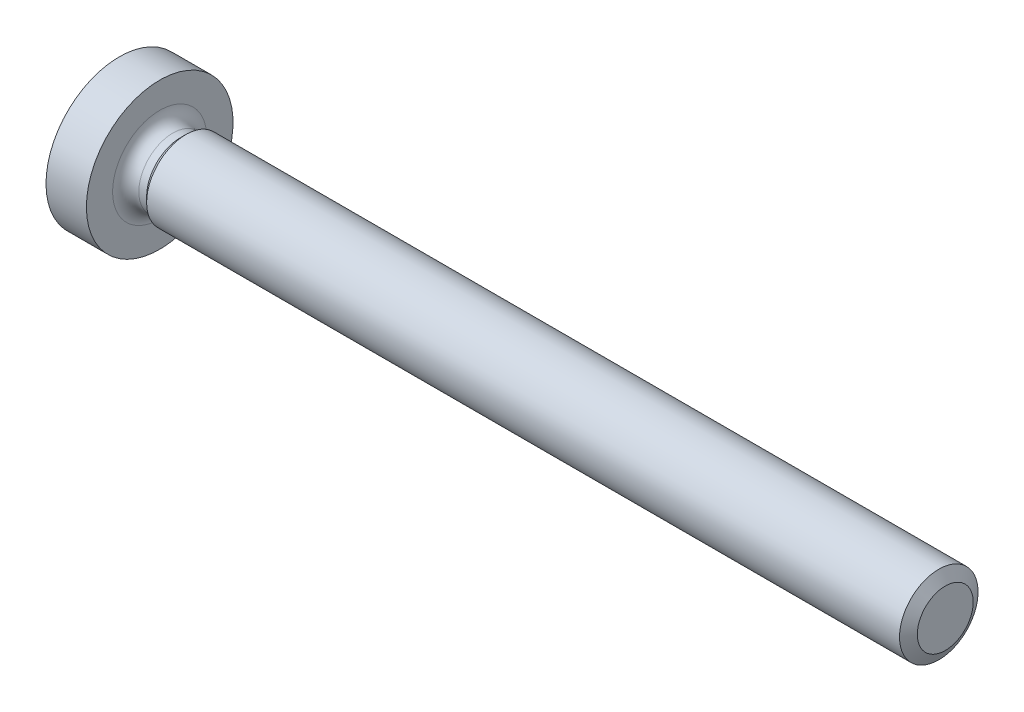
ISO-10303-21;
HEADER;
FILE_DESCRIPTION(('STEP AP214'),'2;1');
FILE_NAME('part.step','',(''),(''),'','','');
FILE_SCHEMA(('AUTOMOTIVE_DESIGN { 1 0 10303 214 1 1 1 1 }'));
ENDSEC;
DATA;
#1=APPLICATION_CONTEXT('core data for automotive mechanical design processes');
#2=APPLICATION_PROTOCOL_DEFINITION('international standard','automotive_design',2000,#1);
#3=PRODUCT_CONTEXT('',#1,'mechanical');
#4=PRODUCT('Part','Part','',(#3));
#5=PRODUCT_RELATED_PRODUCT_CATEGORY('part','',(#4));
#6=PRODUCT_DEFINITION_FORMATION('','',#4);
#7=PRODUCT_DEFINITION_CONTEXT('part definition',#1,'design');
#8=PRODUCT_DEFINITION('design','',#6,#7);
#9=PRODUCT_DEFINITION_SHAPE('','',#8);
#10=(LENGTH_UNIT() NAMED_UNIT(*) SI_UNIT(.MILLI.,.METRE.));
#11=(NAMED_UNIT(*) PLANE_ANGLE_UNIT() SI_UNIT($,.RADIAN.));
#12=(NAMED_UNIT(*) SI_UNIT($,.STERADIAN.) SOLID_ANGLE_UNIT());
#13=UNCERTAINTY_MEASURE_WITH_UNIT(LENGTH_MEASURE(1.E-05),#10,'distance_accuracy_value','');
#14=(GEOMETRIC_REPRESENTATION_CONTEXT(3) GLOBAL_UNCERTAINTY_ASSIGNED_CONTEXT((#13)) GLOBAL_UNIT_ASSIGNED_CONTEXT((#10,
#11,#12)) REPRESENTATION_CONTEXT('',''));
#15=CARTESIAN_POINT('',(0.,0.,0.));
#16=DIRECTION('',(0.,0.,1.));
#17=DIRECTION('',(1.,0.,0.));
#18=AXIS2_PLACEMENT_3D('',#15,#16,#17);
#19=CARTESIAN_POINT('',(1.8,0.,0.));
#20=DIRECTION('',(0.137568371274688,0.,-0.990492273177751));
#21=DIRECTION('',(-0.990492273177752,0.,-0.137568371274688));
#22=AXIS2_PLACEMENT_3D('',#19,#20,#21);
#23=PLANE('',#22);
#24=DIRECTION('',(-0.763885421064628,-0.636571184220523,-0.106095197370087));
#25=VECTOR('',#24,1.);
#26=CARTESIAN_POINT('',(1.8,0.,0.));
#27=LINE('',#26,#25);
#28=CARTESIAN_POINT('',(1.8,0.,0.));
#29=VERTEX_POINT('',#28);
#30=CARTESIAN_POINT('',(0.188839901093437,-1.34263341575547,-0.223772235959245));
#31=VERTEX_POINT('',#30);
#32=EDGE_CURVE('E168',#29,#31,#27,.T.);
#33=ORIENTED_EDGE('',*,*,#32,.F.);
#34=DIRECTION('',(-0.981250680241291,-0.136284816700179,-0.136284816700179));
#35=VECTOR('',#34,1.);
#36=CARTESIAN_POINT('',(1.8,0.,0.));
#37=LINE('',#36,#35);
#38=CARTESIAN_POINT('',(0.0123443765883179,-0.248285503251622,-0.248285503251623));
#39=VERTEX_POINT('',#38);
#40=EDGE_CURVE('E129',#29,#39,#37,.T.);
#41=ORIENTED_EDGE('',*,*,#40,.T.);
#42=CARTESIAN_POINT('',(4.93943981831946,0.,0.436033308099924));
#43=DIRECTION('',(0.137568371274688,0.,-0.990492273177751));
#44=DIRECTION('',(-0.990492273177752,0.,-0.137568371274688));
#45=AXIS2_PLACEMENT_3D('',#42,#43,#44);
#46=CIRCLE('',#45,4.98058304002877);
#47=EDGE_CURVE('E142',#31,#39,#46,.T.);
#48=ORIENTED_EDGE('',*,*,#47,.F.);
#49=EDGE_LOOP('',(#33,#41,#48));
#50=FACE_BOUND('',#49,.T.);
#51=ADVANCED_FACE('F49',(#50),#23,.F.);
#52=CARTESIAN_POINT('',(1.8,0.,0.));
#53=DIRECTION('',(0.137568371274688,0.,0.990492273177752));
#54=DIRECTION('',(0.990492273177752,0.,-0.137568371274688));
#55=AXIS2_PLACEMENT_3D('',#52,#53,#54);
#56=PLANE('',#55);
#57=CARTESIAN_POINT('',(4.93943981831946,0.,-0.436033308099924));
#58=DIRECTION('',(0.137568371274688,0.,0.990492273177752));
#59=DIRECTION('',(0.990492273177752,0.,-0.137568371274688));
#60=AXIS2_PLACEMENT_3D('',#57,#58,#59);
#61=CIRCLE('',#60,4.98058304002877);
#62=CARTESIAN_POINT('',(0.0123443765883179,-0.248285503251624,0.248285503251622));
#63=VERTEX_POINT('',#62);
#64=CARTESIAN_POINT('',(0.188839901093437,-1.34263341575547,0.223772235959245));
#65=VERTEX_POINT('',#64);
#66=EDGE_CURVE('E72',#63,#65,#61,.T.);
#67=ORIENTED_EDGE('',*,*,#66,.F.);
#68=DIRECTION('',(0.981250680241291,0.13628481670018,-0.136284816700179));
#69=VECTOR('',#68,1.);
#70=CARTESIAN_POINT('',(1.8,0.,0.));
#71=LINE('',#70,#69);
#72=EDGE_CURVE('E13',#63,#29,#71,.T.);
#73=ORIENTED_EDGE('',*,*,#72,.T.);
#74=DIRECTION('',(-0.763885421064628,-0.636571184220523,0.106095197370087));
#75=VECTOR('',#74,1.);
#76=CARTESIAN_POINT('',(1.8,0.,0.));
#77=LINE('',#76,#75);
#78=EDGE_CURVE('E169',#29,#65,#77,.T.);
#79=ORIENTED_EDGE('',*,*,#78,.T.);
#80=EDGE_LOOP('',(#67,#73,#79));
#81=FACE_BOUND('',#80,.T.);
#82=ADVANCED_FACE('F184',(#81),#56,.F.);
#83=CARTESIAN_POINT('',(-1.33175770411172,0.,0.));
#84=DIRECTION('',(-1.,0.,0.));
#85=DIRECTION('',(0.,0.,1.));
#86=AXIS2_PLACEMENT_3D('',#83,#84,#85);
#87=CYLINDRICAL_SURFACE('',#86,1.5);
#88=CARTESIAN_POINT('',(3.4,0.,0.));
#89=DIRECTION('',(-1.,0.,0.));
#90=DIRECTION('',(0.,0.,1.));
#91=AXIS2_PLACEMENT_3D('',#88,#89,#90);
#92=CIRCLE('',#91,1.5);
#93=CARTESIAN_POINT('',(3.4,0.,1.5));
#94=VERTEX_POINT('',#93);
#95=EDGE_CURVE('E205',#94,#94,#92,.T.);
#96=ORIENTED_EDGE('',*,*,#95,.F.);
#97=EDGE_LOOP('',(#96));
#98=FACE_BOUND('',#97,.T.);
#99=CARTESIAN_POINT('',(32.1527080028722,0.,0.));
#100=DIRECTION('',(-1.,0.,0.));
#101=DIRECTION('',(0.,0.,1.));
#102=AXIS2_PLACEMENT_3D('',#99,#100,#101);
#103=CIRCLE('',#102,1.5);
#104=CARTESIAN_POINT('',(32.1527080028722,0.,1.5));
#105=VERTEX_POINT('',#104);
#106=EDGE_CURVE('E202',#105,#105,#103,.T.);
#107=ORIENTED_EDGE('',*,*,#106,.T.);
#108=EDGE_LOOP('',(#107));
#109=FACE_BOUND('',#108,.T.);
#110=ADVANCED_FACE('F249',(#98,#109),#87,.T.);
#111=CARTESIAN_POINT('',(5.,0.,0.));
#112=DIRECTION('',(-1.,0.,0.));
#113=DIRECTION('',(0.,1.,0.));
#114=AXIS2_PLACEMENT_3D('',#111,#112,#113);
#115=SPHERICAL_SURFACE('',#114,5.);
#116=CARTESIAN_POINT('',(3.68852459016393,0.,-1.57377049180328));
#117=DIRECTION('',(0.64018439966448,0.,0.768221279597376));
#118=DIRECTION('',(0.768221279597376,0.,-0.64018439966448));
#119=AXIS2_PLACEMENT_3D('',#116,#117,#118);
#120=CIRCLE('',#119,4.56106113624062);
#121=CARTESIAN_POINT('',(0.188839901093437,0.22377223595924,1.34263341575547));
#122=VERTEX_POINT('',#121);
#123=CARTESIAN_POINT('',(0.188839901093437,-0.22377223595925,1.34263341575547));
#124=VERTEX_POINT('',#123);
#125=EDGE_CURVE('E135',#122,#124,#120,.T.);
#126=ORIENTED_EDGE('',*,*,#125,.T.);
#127=CARTESIAN_POINT('',(4.93943981831946,0.436033308099924,0.));
#128=DIRECTION('',(0.137568371274688,-0.990492273177751,0.));
#129=DIRECTION('',(0.990492273177752,0.137568371274688,0.));
#130=AXIS2_PLACEMENT_3D('',#127,#128,#129);
#131=CIRCLE('',#130,4.98058304002877);
#132=EDGE_CURVE('E151',#124,#63,#131,.T.);
#133=ORIENTED_EDGE('',*,*,#132,.T.);
#134=ORIENTED_EDGE('',*,*,#66,.T.);
#135=CARTESIAN_POINT('',(3.68852459016393,1.57377049180328,0.));
#136=DIRECTION('',(0.64018439966448,-0.768221279597376,0.));
#137=DIRECTION('',(0.768221279597376,0.64018439966448,0.));
#138=AXIS2_PLACEMENT_3D('',#135,#136,#137);
#139=CIRCLE('',#138,4.56106113624062);
#140=EDGE_CURVE('E181',#65,#31,#139,.T.);
#141=ORIENTED_EDGE('',*,*,#140,.T.);
#142=ORIENTED_EDGE('',*,*,#47,.T.);
#143=CARTESIAN_POINT('',(0.188839901093437,-0.22377223595924,-1.34263341575547));
#144=VERTEX_POINT('',#143);
#145=EDGE_CURVE('E131',#39,#144,#131,.T.);
#146=ORIENTED_EDGE('',*,*,#145,.T.);
#147=CARTESIAN_POINT('',(3.68852459016393,0.,1.57377049180328));
#148=DIRECTION('',(0.64018439966448,0.,-0.768221279597376));
#149=DIRECTION('',(-0.768221279597376,0.,-0.64018439966448));
#150=AXIS2_PLACEMENT_3D('',#147,#148,#149);
#151=CIRCLE('',#150,4.56106113624062);
#152=CARTESIAN_POINT('',(0.188839901093437,0.223772235959249,-1.34263341575547));
#153=VERTEX_POINT('',#152);
#154=EDGE_CURVE('E123',#144,#153,#151,.T.);
#155=ORIENTED_EDGE('',*,*,#154,.T.);
#156=CARTESIAN_POINT('',(4.93943981831946,-0.436033308099924,0.));
#157=DIRECTION('',(0.137568371274688,0.990492273177752,0.));
#158=DIRECTION('',(-0.990492273177752,0.137568371274688,0.));
#159=AXIS2_PLACEMENT_3D('',#156,#157,#158);
#160=CIRCLE('',#159,4.98058304002877);
#161=CARTESIAN_POINT('',(0.0123443765883179,0.248285503251624,-0.248285503251623));
#162=VERTEX_POINT('',#161);
#163=EDGE_CURVE('E114',#153,#162,#160,.T.);
#164=ORIENTED_EDGE('',*,*,#163,.T.);
#165=CARTESIAN_POINT('',(0.188839901093437,1.34263341575547,-0.223772235959245));
#166=VERTEX_POINT('',#165);
#167=EDGE_CURVE('E159',#162,#166,#46,.T.);
#168=ORIENTED_EDGE('',*,*,#167,.T.);
#169=CARTESIAN_POINT('',(3.68852459016393,-1.57377049180328,0.));
#170=DIRECTION('',(0.64018439966448,0.768221279597376,0.));
#171=DIRECTION('',(-0.768221279597376,0.64018439966448,0.));
#172=AXIS2_PLACEMENT_3D('',#169,#170,#171);
#173=CIRCLE('',#172,4.56106113624062);
#174=CARTESIAN_POINT('',(0.188839901093437,1.34263341575547,0.223772235959245));
#175=VERTEX_POINT('',#174);
#176=EDGE_CURVE('E172',#166,#175,#173,.T.);
#177=ORIENTED_EDGE('',*,*,#176,.T.);
#178=CARTESIAN_POINT('',(0.0123443765883179,0.248285503251622,0.248285503251622));
#179=VERTEX_POINT('',#178);
#180=EDGE_CURVE('E164',#175,#179,#61,.T.);
#181=ORIENTED_EDGE('',*,*,#180,.T.);
#182=EDGE_CURVE('E64',#179,#122,#160,.T.);
#183=ORIENTED_EDGE('',*,*,#182,.T.);
#184=EDGE_LOOP('',(#126,#133,#134,#141,#142,#146,#155,#164,#168,#177,#181,#183));
#185=FACE_BOUND('',#184,.T.);
#186=CARTESIAN_POINT('',(0.857536964558404,0.,0.));
#187=DIRECTION('',(-1.,0.,0.));
#188=DIRECTION('',(0.,0.,1.));
#189=AXIS2_PLACEMENT_3D('',#186,#187,#188);
#190=CIRCLE('',#189,2.8);
#191=CARTESIAN_POINT('',(0.857536964558404,0.,2.8));
#192=VERTEX_POINT('',#191);
#193=EDGE_CURVE('E185',#192,#192,#190,.T.);
#194=ORIENTED_EDGE('',*,*,#193,.T.);
#195=EDGE_LOOP('',(#194));
#196=FACE_BOUND('',#195,.T.);
#197=ADVANCED_FACE('F51',(#185,#196),#115,.T.);
#198=CARTESIAN_POINT('',(-1.33175770411172,0.,0.));
#199=DIRECTION('',(-1.,0.,0.));
#200=DIRECTION('',(0.,0.,1.));
#201=AXIS2_PLACEMENT_3D('',#198,#199,#200);
#202=CYLINDRICAL_SURFACE('',#201,2.8);
#203=ORIENTED_EDGE('',*,*,#193,.F.);
#204=EDGE_LOOP('',(#203));
#205=FACE_BOUND('',#204,.T.);
#206=CARTESIAN_POINT('',(2.4,0.,0.));
#207=DIRECTION('',(-1.,0.,0.));
#208=DIRECTION('',(0.,0.,1.));
#209=AXIS2_PLACEMENT_3D('',#206,#207,#208);
#210=CIRCLE('',#209,2.8);
#211=CARTESIAN_POINT('',(2.4,0.,2.8));
#212=VERTEX_POINT('',#211);
#213=EDGE_CURVE('E188',#212,#212,#210,.T.);
#214=ORIENTED_EDGE('',*,*,#213,.T.);
#215=EDGE_LOOP('',(#214));
#216=FACE_BOUND('',#215,.T.);
#217=ADVANCED_FACE('F222',(#205,#216),#202,.T.);
#218=CARTESIAN_POINT('',(2.4,1.8,0.));
#219=DIRECTION('',(-1.,0.,0.));
#220=DIRECTION('',(0.,0.,1.));
#221=AXIS2_PLACEMENT_3D('',#218,#219,#220);
#222=PLANE('',#221);
#223=ORIENTED_EDGE('',*,*,#213,.F.);
#224=EDGE_LOOP('',(#223));
#225=FACE_BOUND('',#224,.T.);
#226=CARTESIAN_POINT('',(2.4,0.,0.));
#227=DIRECTION('',(-1.,0.,0.));
#228=DIRECTION('',(0.,0.,1.));
#229=AXIS2_PLACEMENT_3D('',#226,#227,#228);
#230=CIRCLE('',#229,1.8);
#231=CARTESIAN_POINT('',(2.4,0.,1.8));
#232=VERTEX_POINT('',#231);
#233=EDGE_CURVE('E214',#232,#232,#230,.T.);
#234=ORIENTED_EDGE('',*,*,#233,.T.);
#235=EDGE_LOOP('',(#234));
#236=FACE_BOUND('',#235,.T.);
#237=ADVANCED_FACE('F224',(#225,#236),#222,.F.);
#238=CARTESIAN_POINT('',(2.901,0.,0.));
#239=DIRECTION('',(-1.,0.,0.));
#240=DIRECTION('',(0.,0.,1.));
#241=AXIS2_PLACEMENT_3D('',#238,#239,#240);
#242=TOROIDAL_SURFACE('',#241,1.8,0.501);
#243=ORIENTED_EDGE('',*,*,#233,.F.);
#244=EDGE_LOOP('',(#243));
#245=FACE_BOUND('',#244,.T.);
#246=CARTESIAN_POINT('',(2.901,0.,0.));
#247=DIRECTION('',(-1.,0.,0.));
#248=DIRECTION('',(0.,0.,1.));
#249=AXIS2_PLACEMENT_3D('',#246,#247,#248);
#250=CIRCLE('',#249,1.299);
#251=CARTESIAN_POINT('',(2.901,0.,1.299));
#252=VERTEX_POINT('',#251);
#253=EDGE_CURVE('E211',#252,#252,#250,.T.);
#254=ORIENTED_EDGE('',*,*,#253,.T.);
#255=EDGE_LOOP('',(#254));
#256=FACE_BOUND('',#255,.T.);
#257=ADVANCED_FACE('F227',(#245,#256),#242,.F.);
#258=CARTESIAN_POINT('',(-1.33175770411172,0.,0.));
#259=DIRECTION('',(-1.,0.,0.));
#260=DIRECTION('',(0.,0.,1.));
#261=AXIS2_PLACEMENT_3D('',#258,#259,#260);
#262=CYLINDRICAL_SURFACE('',#261,1.299);
#263=ORIENTED_EDGE('',*,*,#253,.F.);
#264=EDGE_LOOP('',(#263));
#265=FACE_BOUND('',#264,.T.);
#266=CARTESIAN_POINT('',(3.199,0.,0.));
#267=DIRECTION('',(-1.,0.,0.));
#268=DIRECTION('',(0.,0.,1.));
#269=AXIS2_PLACEMENT_3D('',#266,#267,#268);
#270=CIRCLE('',#269,1.299);
#271=CARTESIAN_POINT('',(3.199,0.,1.299));
#272=VERTEX_POINT('',#271);
#273=EDGE_CURVE('E208',#272,#272,#270,.T.);
#274=ORIENTED_EDGE('',*,*,#273,.T.);
#275=EDGE_LOOP('',(#274));
#276=FACE_BOUND('',#275,.T.);
#277=ADVANCED_FACE('F233',(#265,#276),#262,.T.);
#278=CARTESIAN_POINT('',(3.4,0.,0.));
#279=DIRECTION('',(1.,0.,0.));
#280=DIRECTION('',(0.,0.,-1.));
#281=AXIS2_PLACEMENT_3D('',#278,#279,#280);
#282=CONICAL_SURFACE('',#281,1.5,0.785398163397443);
#283=ORIENTED_EDGE('',*,*,#273,.F.);
#284=EDGE_LOOP('',(#283));
#285=FACE_BOUND('',#284,.T.);
#286=ORIENTED_EDGE('',*,*,#95,.T.);
#287=EDGE_LOOP('',(#286));
#288=FACE_BOUND('',#287,.T.);
#289=ADVANCED_FACE('F239',(#285,#288),#282,.T.);
#290=CARTESIAN_POINT('',(32.1527080028722,0.,0.));
#291=DIRECTION('',(-1.,0.,0.));
#292=DIRECTION('',(0.,0.,1.));
#293=AXIS2_PLACEMENT_3D('',#290,#291,#292);
#294=CONICAL_SURFACE('',#293,1.5,1.05188801855298);
#295=CARTESIAN_POINT('',(32.4,0.,0.));
#296=DIRECTION('',(-1.,0.,0.));
#297=DIRECTION('',(0.,0.,1.));
#298=AXIS2_PLACEMENT_3D('',#295,#296,#297);
#299=CIRCLE('',#298,1.067);
#300=CARTESIAN_POINT('',(32.4,0.,1.067));
#301=VERTEX_POINT('',#300);
#302=EDGE_CURVE('E173',#301,#301,#299,.T.);
#303=ORIENTED_EDGE('',*,*,#302,.T.);
#304=EDGE_LOOP('',(#303));
#305=FACE_BOUND('',#304,.T.);
#306=ORIENTED_EDGE('',*,*,#106,.F.);
#307=EDGE_LOOP('',(#306));
#308=FACE_BOUND('',#307,.T.);
#309=ADVANCED_FACE('F245',(#305,#308),#294,.T.);
#310=CARTESIAN_POINT('',(32.4,0.,0.));
#311=DIRECTION('',(-1.,0.,0.));
#312=DIRECTION('',(0.,0.,1.));
#313=AXIS2_PLACEMENT_3D('',#310,#311,#312);
#314=PLANE('',#313);
#315=ORIENTED_EDGE('',*,*,#302,.F.);
#316=EDGE_LOOP('',(#315));
#317=FACE_BOUND('',#316,.T.);
#318=ADVANCED_FACE('F256',(#317),#314,.F.);
#319=ORIENTED_EDGE('',*,*,#167,.F.);
#320=DIRECTION('',(0.981250680241291,-0.13628481670018,0.136284816700179));
#321=VECTOR('',#320,1.);
#322=CARTESIAN_POINT('',(1.8,0.,0.));
#323=LINE('',#322,#321);
#324=EDGE_CURVE('E112',#162,#29,#323,.T.);
#325=ORIENTED_EDGE('',*,*,#324,.T.);
#326=DIRECTION('',(-0.763885421064628,0.636571184220523,-0.106095197370087));
#327=VECTOR('',#326,1.);
#328=CARTESIAN_POINT('',(1.8,0.,0.));
#329=LINE('',#328,#327);
#330=EDGE_CURVE('E158',#29,#166,#329,.T.);
#331=ORIENTED_EDGE('',*,*,#330,.T.);
#332=EDGE_LOOP('',(#319,#325,#331));
#333=FACE_BOUND('',#332,.T.);
#334=ADVANCED_FACE('F156',(#333),#23,.F.);
#335=CARTESIAN_POINT('',(0.,1.5,-0.25));
#336=DIRECTION('',(0.64018439966448,0.768221279597376,0.));
#337=DIRECTION('',(-0.768221279597376,0.64018439966448,0.));
#338=AXIS2_PLACEMENT_3D('',#335,#336,#337);
#339=PLANE('',#338);
#340=ORIENTED_EDGE('',*,*,#330,.F.);
#341=DIRECTION('',(-0.763885421064628,0.636571184220523,0.106095197370087));
#342=VECTOR('',#341,1.);
#343=CARTESIAN_POINT('',(1.8,0.,0.));
#344=LINE('',#343,#342);
#345=EDGE_CURVE('E162',#29,#175,#344,.T.);
#346=ORIENTED_EDGE('',*,*,#345,.T.);
#347=ORIENTED_EDGE('',*,*,#176,.F.);
#348=EDGE_LOOP('',(#340,#346,#347));
#349=FACE_BOUND('',#348,.T.);
#350=ADVANCED_FACE('F171',(#349),#339,.F.);
#351=CARTESIAN_POINT('',(0.,-1.5,0.25));
#352=DIRECTION('',(0.64018439966448,-0.768221279597376,0.));
#353=DIRECTION('',(0.768221279597376,0.64018439966448,0.));
#354=AXIS2_PLACEMENT_3D('',#351,#352,#353);
#355=PLANE('',#354);
#356=ORIENTED_EDGE('',*,*,#78,.F.);
#357=ORIENTED_EDGE('',*,*,#32,.T.);
#358=ORIENTED_EDGE('',*,*,#140,.F.);
#359=EDGE_LOOP('',(#356,#357,#358));
#360=FACE_BOUND('',#359,.T.);
#361=ADVANCED_FACE('F180',(#360),#355,.F.);
#362=ORIENTED_EDGE('',*,*,#345,.F.);
#363=DIRECTION('',(-0.981250680241291,0.136284816700179,0.136284816700179));
#364=VECTOR('',#363,1.);
#365=CARTESIAN_POINT('',(1.8,0.,0.));
#366=LINE('',#365,#364);
#367=EDGE_CURVE('E57',#29,#179,#366,.T.);
#368=ORIENTED_EDGE('',*,*,#367,.T.);
#369=ORIENTED_EDGE('',*,*,#180,.F.);
#370=EDGE_LOOP('',(#362,#368,#369));
#371=FACE_BOUND('',#370,.T.);
#372=ADVANCED_FACE('F163',(#371),#56,.F.);
#373=CARTESIAN_POINT('',(1.8,0.,0.));
#374=DIRECTION('',(0.137568371274688,-0.990492273177751,0.));
#375=DIRECTION('',(-0.990492273177752,-0.137568371274688,0.));
#376=AXIS2_PLACEMENT_3D('',#373,#374,#375);
#377=PLANE('',#376);
#378=DIRECTION('',(-0.763885421064628,-0.106095197370089,0.636571184220523));
#379=VECTOR('',#378,1.);
#380=CARTESIAN_POINT('',(1.8,0.,0.));
#381=LINE('',#380,#379);
#382=EDGE_CURVE('E126',#29,#124,#381,.T.);
#383=ORIENTED_EDGE('',*,*,#382,.F.);
#384=ORIENTED_EDGE('',*,*,#72,.F.);
#385=ORIENTED_EDGE('',*,*,#132,.F.);
#386=EDGE_LOOP('',(#383,#384,#385));
#387=FACE_BOUND('',#386,.T.);
#388=ADVANCED_FACE('F150',(#387),#377,.F.);
#389=CARTESIAN_POINT('',(1.8,0.,0.));
#390=DIRECTION('',(0.137568371274688,0.990492273177752,0.));
#391=DIRECTION('',(0.990492273177752,-0.137568371274688,0.));
#392=AXIS2_PLACEMENT_3D('',#389,#390,#391);
#393=PLANE('',#392);
#394=ORIENTED_EDGE('',*,*,#367,.F.);
#395=DIRECTION('',(-0.763885421064628,0.106095197370085,0.636571184220523));
#396=VECTOR('',#395,1.);
#397=CARTESIAN_POINT('',(1.8,0.,0.));
#398=LINE('',#397,#396);
#399=EDGE_CURVE('E117',#29,#122,#398,.T.);
#400=ORIENTED_EDGE('',*,*,#399,.T.);
#401=ORIENTED_EDGE('',*,*,#182,.F.);
#402=EDGE_LOOP('',(#394,#400,#401));
#403=FACE_BOUND('',#402,.T.);
#404=ADVANCED_FACE('F138',(#403),#393,.F.);
#405=CARTESIAN_POINT('',(0.,-0.250000000000005,1.5));
#406=DIRECTION('',(0.64018439966448,0.,0.768221279597376));
#407=DIRECTION('',(-0.768221279597376,0.,0.64018439966448));
#408=AXIS2_PLACEMENT_3D('',#405,#406,#407);
#409=PLANE('',#408);
#410=ORIENTED_EDGE('',*,*,#399,.F.);
#411=ORIENTED_EDGE('',*,*,#382,.T.);
#412=ORIENTED_EDGE('',*,*,#125,.F.);
#413=EDGE_LOOP('',(#410,#411,#412));
#414=FACE_BOUND('',#413,.T.);
#415=ADVANCED_FACE('F146',(#414),#409,.F.);
#416=ORIENTED_EDGE('',*,*,#40,.F.);
#417=DIRECTION('',(-0.763885421064628,-0.106095197370085,-0.636571184220523));
#418=VECTOR('',#417,1.);
#419=CARTESIAN_POINT('',(1.8,0.,0.));
#420=LINE('',#419,#418);
#421=EDGE_CURVE('E120',#29,#144,#420,.T.);
#422=ORIENTED_EDGE('',*,*,#421,.T.);
#423=ORIENTED_EDGE('',*,*,#145,.F.);
#424=EDGE_LOOP('',(#416,#422,#423));
#425=FACE_BOUND('',#424,.T.);
#426=ADVANCED_FACE('F130',(#425),#377,.F.);
#427=CARTESIAN_POINT('',(0.,0.250000000000005,-1.5));
#428=DIRECTION('',(0.64018439966448,0.,-0.768221279597376));
#429=DIRECTION('',(0.768221279597376,0.,0.64018439966448));
#430=AXIS2_PLACEMENT_3D('',#427,#428,#429);
#431=PLANE('',#430);
#432=ORIENTED_EDGE('',*,*,#421,.F.);
#433=DIRECTION('',(-0.763885421064628,0.106095197370089,-0.636571184220523));
#434=VECTOR('',#433,1.);
#435=CARTESIAN_POINT('',(1.8,0.,0.));
#436=LINE('',#435,#434);
#437=EDGE_CURVE('E108',#29,#153,#436,.T.);
#438=ORIENTED_EDGE('',*,*,#437,.T.);
#439=ORIENTED_EDGE('',*,*,#154,.F.);
#440=EDGE_LOOP('',(#432,#438,#439));
#441=FACE_BOUND('',#440,.T.);
#442=ADVANCED_FACE('F122',(#441),#431,.F.);
#443=ORIENTED_EDGE('',*,*,#437,.F.);
#444=ORIENTED_EDGE('',*,*,#324,.F.);
#445=ORIENTED_EDGE('',*,*,#163,.F.);
#446=EDGE_LOOP('',(#443,#444,#445));
#447=FACE_BOUND('',#446,.T.);
#448=ADVANCED_FACE('F110',(#447),#393,.F.);
#449=CLOSED_SHELL('',(#51,#82,#110,#197,#217,#237,#257,#277,#289,#309,#318,#334,#350,#361,#372,
#388,#404,#415,#426,#442,#448));
#450=MANIFOLD_SOLID_BREP('B2',#449);
#451=ADVANCED_BREP_SHAPE_REPRESENTATION('',(#18,#450),#14);
#452=SHAPE_DEFINITION_REPRESENTATION(#9,#451);
ENDSEC;
END-ISO-10303-21;
